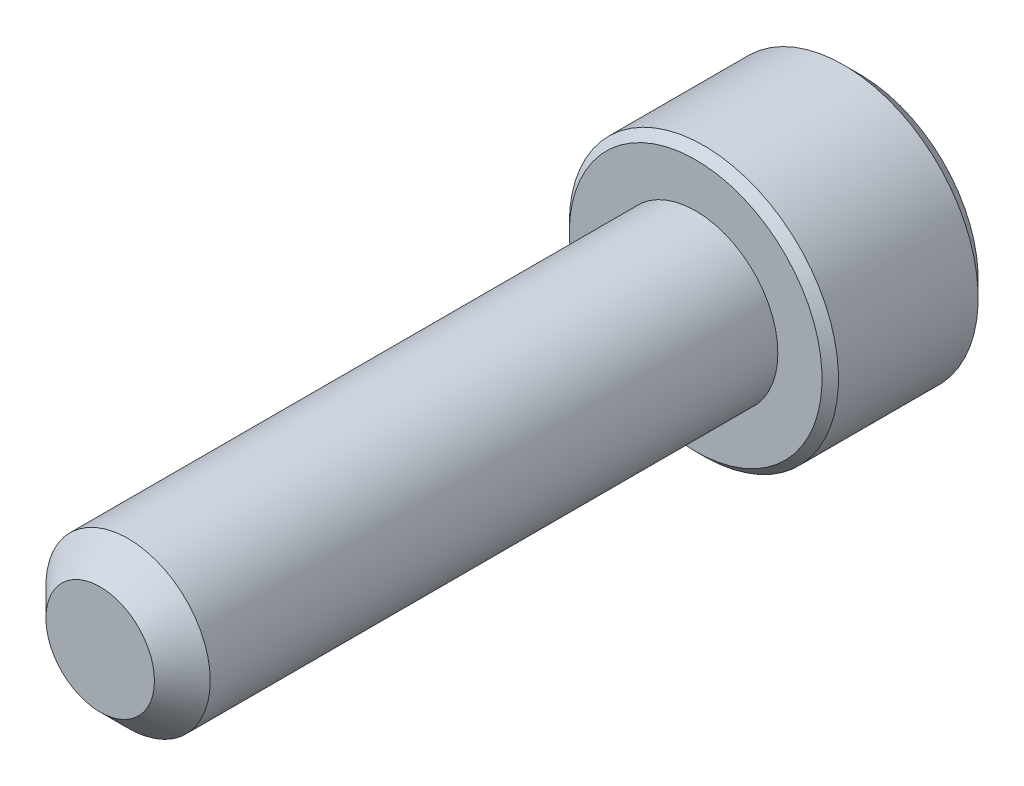
ISO-10303-21;
HEADER;
FILE_DESCRIPTION(('STEP AP214'),'2;1');
FILE_NAME('part.step','',(''),(''),'','','');
FILE_SCHEMA(('AUTOMOTIVE_DESIGN { 1 0 10303 214 1 1 1 1 }'));
ENDSEC;
DATA;
#1=APPLICATION_CONTEXT('core data for automotive mechanical design processes');
#2=APPLICATION_PROTOCOL_DEFINITION('international standard','automotive_design',2000,#1);
#3=PRODUCT_CONTEXT('',#1,'mechanical');
#4=PRODUCT('Part','Part','',(#3));
#5=PRODUCT_RELATED_PRODUCT_CATEGORY('part','',(#4));
#6=PRODUCT_DEFINITION_FORMATION('','',#4);
#7=PRODUCT_DEFINITION_CONTEXT('part definition',#1,'design');
#8=PRODUCT_DEFINITION('design','',#6,#7);
#9=PRODUCT_DEFINITION_SHAPE('','',#8);
#10=(LENGTH_UNIT() NAMED_UNIT(*) SI_UNIT(.MILLI.,.METRE.));
#11=(NAMED_UNIT(*) PLANE_ANGLE_UNIT() SI_UNIT($,.RADIAN.));
#12=(NAMED_UNIT(*) SI_UNIT($,.STERADIAN.) SOLID_ANGLE_UNIT());
#13=UNCERTAINTY_MEASURE_WITH_UNIT(LENGTH_MEASURE(1.E-05),#10,'distance_accuracy_value','');
#14=(GEOMETRIC_REPRESENTATION_CONTEXT(3) GLOBAL_UNCERTAINTY_ASSIGNED_CONTEXT((#13)) GLOBAL_UNIT_ASSIGNED_CONTEXT((#10,
#11,#12)) REPRESENTATION_CONTEXT('',''));
#15=CARTESIAN_POINT('',(0.,0.,0.));
#16=DIRECTION('',(0.,0.,1.));
#17=DIRECTION('',(1.,0.,0.));
#18=AXIS2_PLACEMENT_3D('',#15,#16,#17);
#19=CARTESIAN_POINT('',(0.,0.,-12.7));
#20=DIRECTION('',(0.,0.,1.));
#21=DIRECTION('',(1.,0.,0.));
#22=AXIS2_PLACEMENT_3D('',#19,#20,#21);
#23=CYLINDRICAL_SURFACE('',#22,1.7526);
#24=CARTESIAN_POINT('',(0.,0.,-0.595312500000002));
#25=DIRECTION('',(0.,0.,1.));
#26=DIRECTION('',(1.,0.,0.));
#27=AXIS2_PLACEMENT_3D('',#24,#25,#26);
#28=CIRCLE('',#27,1.7526);
#29=CARTESIAN_POINT('',(1.7526,0.,-0.595312500000002));
#30=VERTEX_POINT('',#29);
#31=EDGE_CURVE('E111',#30,#30,#28,.F.);
#32=ORIENTED_EDGE('',*,*,#31,.T.);
#33=EDGE_LOOP('',(#32));
#34=FACE_BOUND('',#33,.T.);
#35=CARTESIAN_POINT('',(0.,0.,-12.7));
#36=DIRECTION('',(0.,0.,-1.));
#37=DIRECTION('',(-1.,0.,0.));
#38=AXIS2_PLACEMENT_3D('',#35,#36,#37);
#39=CIRCLE('',#38,1.7526);
#40=CARTESIAN_POINT('',(-1.7526,0.,-12.7));
#41=VERTEX_POINT('',#40);
#42=EDGE_CURVE('E211',#41,#41,#39,.F.);
#43=ORIENTED_EDGE('',*,*,#42,.T.);
#44=EDGE_LOOP('',(#43));
#45=FACE_BOUND('',#44,.T.);
#46=ADVANCED_FACE('F37',(#34,#45),#23,.T.);
#47=CARTESIAN_POINT('',(0.,0.,0.));
#48=DIRECTION('',(0.,0.,1.));
#49=DIRECTION('',(1.,0.,0.));
#50=AXIS2_PLACEMENT_3D('',#47,#48,#49);
#51=PLANE('',#50);
#52=CARTESIAN_POINT('',(0.,0.,0.));
#53=DIRECTION('',(0.,0.,1.));
#54=DIRECTION('',(1.,0.,0.));
#55=AXIS2_PLACEMENT_3D('',#52,#53,#54);
#56=CIRCLE('',#55,1.1572875);
#57=CARTESIAN_POINT('',(1.1572875,0.,0.));
#58=VERTEX_POINT('',#57);
#59=EDGE_CURVE('E210',#58,#58,#56,.T.);
#60=ORIENTED_EDGE('',*,*,#59,.T.);
#61=EDGE_LOOP('',(#60));
#62=FACE_BOUND('',#61,.T.);
#63=ADVANCED_FACE('F188',(#62),#51,.T.);
#64=CARTESIAN_POINT('',(0.,0.,0.));
#65=DIRECTION('',(0.,0.,-1.));
#66=DIRECTION('',(-1.,0.,0.));
#67=AXIS2_PLACEMENT_3D('',#64,#65,#66);
#68=CONICAL_SURFACE('',#67,1.1572875,0.785398163397447);
#69=ORIENTED_EDGE('',*,*,#31,.F.);
#70=EDGE_LOOP('',(#69));
#71=FACE_BOUND('',#70,.T.);
#72=ORIENTED_EDGE('',*,*,#59,.F.);
#73=EDGE_LOOP('',(#72));
#74=FACE_BOUND('',#73,.T.);
#75=ADVANCED_FACE('F194',(#71,#74),#68,.T.);
#76=CARTESIAN_POINT('',(0.,0.,-16.2052));
#77=DIRECTION('',(0.,0.,1.));
#78=DIRECTION('',(1.,0.,0.));
#79=AXIS2_PLACEMENT_3D('',#76,#77,#78);
#80=CYLINDRICAL_SURFACE('',#79,2.8702);
#81=CARTESIAN_POINT('',(0.,0.,-12.87526));
#82=DIRECTION('',(0.,0.,-1.));
#83=DIRECTION('',(-1.,0.,0.));
#84=AXIS2_PLACEMENT_3D('',#81,#82,#83);
#85=CIRCLE('',#84,2.8702);
#86=CARTESIAN_POINT('',(-2.8702,0.,-12.87526));
#87=VERTEX_POINT('',#86);
#88=EDGE_CURVE('E45',#87,#87,#85,.T.);
#89=ORIENTED_EDGE('',*,*,#88,.T.);
#90=EDGE_LOOP('',(#89));
#91=FACE_BOUND('',#90,.T.);
#92=CARTESIAN_POINT('',(0.,0.,-15.85468));
#93=DIRECTION('',(0.,0.,-1.));
#94=DIRECTION('',(-1.,0.,0.));
#95=AXIS2_PLACEMENT_3D('',#92,#93,#94);
#96=CIRCLE('',#95,2.8702);
#97=CARTESIAN_POINT('',(-2.8702,0.,-15.85468));
#98=VERTEX_POINT('',#97);
#99=EDGE_CURVE('E171',#98,#98,#96,.F.);
#100=ORIENTED_EDGE('',*,*,#99,.T.);
#101=EDGE_LOOP('',(#100));
#102=FACE_BOUND('',#101,.T.);
#103=ADVANCED_FACE('F176',(#91,#102),#80,.T.);
#104=CARTESIAN_POINT('',(0.,0.,-16.2052));
#105=DIRECTION('',(0.,0.,-1.));
#106=DIRECTION('',(-1.,0.,0.));
#107=AXIS2_PLACEMENT_3D('',#104,#105,#106);
#108=PLANE('',#107);
#109=CARTESIAN_POINT('',(0.,0.,-16.2052));
#110=DIRECTION('',(0.,0.,-1.));
#111=DIRECTION('',(-1.,0.,0.));
#112=AXIS2_PLACEMENT_3D('',#109,#110,#111);
#113=CIRCLE('',#112,2.51968);
#114=CARTESIAN_POINT('',(-2.51968,0.,-16.2052));
#115=VERTEX_POINT('',#114);
#116=EDGE_CURVE('E110',#115,#115,#113,.T.);
#117=ORIENTED_EDGE('',*,*,#116,.T.);
#118=EDGE_LOOP('',(#117));
#119=FACE_BOUND('',#118,.T.);
#120=CARTESIAN_POINT('',(0.,0.,-16.2052));
#121=DIRECTION('',(0.,0.,-1.));
#122=DIRECTION('',(-1.,0.,0.));
#123=AXIS2_PLACEMENT_3D('',#120,#121,#122);
#124=CIRCLE('',#123,1.60395121659243);
#125=CARTESIAN_POINT('',(-1.3890625,0.801975608296217,-16.2052));
#126=VERTEX_POINT('',#125);
#127=CARTESIAN_POINT('',(0.,1.60395121659243,-16.2052));
#128=VERTEX_POINT('',#127);
#129=EDGE_CURVE('E91',#126,#128,#124,.T.);
#130=ORIENTED_EDGE('',*,*,#129,.F.);
#131=CARTESIAN_POINT('',(-1.3890625,-0.801975608296215,-16.2052));
#132=VERTEX_POINT('',#131);
#133=EDGE_CURVE('E51',#132,#126,#124,.T.);
#134=ORIENTED_EDGE('',*,*,#133,.F.);
#135=CARTESIAN_POINT('',(0.,-1.60395121659243,-16.2052));
#136=VERTEX_POINT('',#135);
#137=EDGE_CURVE('E267',#136,#132,#124,.T.);
#138=ORIENTED_EDGE('',*,*,#137,.F.);
#139=CARTESIAN_POINT('',(1.3890625,-0.801975608296215,-16.2052));
#140=VERTEX_POINT('',#139);
#141=EDGE_CURVE('E58',#140,#136,#124,.T.);
#142=ORIENTED_EDGE('',*,*,#141,.F.);
#143=CARTESIAN_POINT('',(1.3890625,0.801975608296215,-16.2052));
#144=VERTEX_POINT('',#143);
#145=EDGE_CURVE('E132',#144,#140,#124,.T.);
#146=ORIENTED_EDGE('',*,*,#145,.F.);
#147=EDGE_CURVE('E100',#128,#144,#124,.T.);
#148=ORIENTED_EDGE('',*,*,#147,.F.);
#149=EDGE_LOOP('',(#130,#134,#138,#142,#146,#148));
#150=FACE_BOUND('',#149,.T.);
#151=ADVANCED_FACE('F131',(#119,#150),#108,.T.);
#152=CARTESIAN_POINT('',(0.,0.,-12.7));
#153=DIRECTION('',(0.,0.,-1.));
#154=DIRECTION('',(-1.,0.,0.));
#155=AXIS2_PLACEMENT_3D('',#152,#153,#154);
#156=PLANE('',#155);
#157=CARTESIAN_POINT('',(0.,0.,-12.7));
#158=DIRECTION('',(0.,0.,-1.));
#159=DIRECTION('',(-1.,0.,0.));
#160=AXIS2_PLACEMENT_3D('',#157,#158,#159);
#161=CIRCLE('',#160,2.69494);
#162=CARTESIAN_POINT('',(-2.69494,0.,-12.7));
#163=VERTEX_POINT('',#162);
#164=EDGE_CURVE('E12',#163,#163,#161,.F.);
#165=ORIENTED_EDGE('',*,*,#164,.T.);
#166=EDGE_LOOP('',(#165));
#167=FACE_BOUND('',#166,.T.);
#168=ORIENTED_EDGE('',*,*,#42,.F.);
#169=EDGE_LOOP('',(#168));
#170=FACE_BOUND('',#169,.T.);
#171=ADVANCED_FACE('F279',(#167,#170),#156,.F.);
#172=CARTESIAN_POINT('',(0.,0.,-16.2052));
#173=DIRECTION('',(0.,0.,-1.));
#174=DIRECTION('',(-1.,0.,0.));
#175=AXIS2_PLACEMENT_3D('',#172,#173,#174);
#176=CONICAL_SURFACE('',#175,1.60395121659243,0.78539816339745);
#177=ORIENTED_EDGE('',*,*,#147,.T.);
#178=CARTESIAN_POINT('',(-0.000200000000000534,1.60406668664627,-16.2053154825221));
#179=CARTESIAN_POINT('',(0.047554814899585,1.57649543140889,-16.177764786881));
#180=CARTESIAN_POINT('',(0.0961082129767667,1.54846311395896,-16.1518319141145));
#181=CARTESIAN_POINT('',(0.195114281423183,1.49130193369001,-16.1043489608708));
#182=CARTESIAN_POINT('',(0.245576372730139,1.46216763169007,-16.0828253080794));
#183=CARTESIAN_POINT('',(0.347330835284908,1.40341966534283,-16.0459546019866));
#184=CARTESIAN_POINT('',(0.398597278416374,1.37382097060048,-16.0305148513149));
#185=CARTESIAN_POINT('',(0.502259069123937,1.31397180783079,-16.0067264581829));
#186=CARTESIAN_POINT('',(0.554651247789431,1.28372316937484,-15.9983600517165));
#187=CARTESIAN_POINT('',(0.644944084544834,1.23159257576821,-15.9908113663708));
#188=CARTESIAN_POINT('',(0.6827280342556,1.20977800223165,-15.9896936971037));
#189=CARTESIAN_POINT('',(0.758229287800437,1.16618733317339,-15.9915750513552));
#190=CARTESIAN_POINT('',(0.795946575086517,1.14441124720567,-15.9945749834252));
#191=CARTESIAN_POINT('',(0.871018018906519,1.10106872890774,-16.0045189567457));
#192=CARTESIAN_POINT('',(0.908371804329552,1.0795025108385,-16.0114666704902));
#193=CARTESIAN_POINT('',(0.982452435596039,1.03673203843505,-16.0289288810594));
#194=CARTESIAN_POINT('',(1.01917900521513,1.01552794357906,-16.0394449088769));
#195=CARTESIAN_POINT('',(1.11325413716703,0.961213640822578,-16.0706664203823));
#196=CARTESIAN_POINT('',(1.17001916310317,0.928440337817795,-16.0937263608604));
#197=CARTESIAN_POINT('',(1.25348479270274,0.880251434100403,-16.1326547118294));
#198=CARTESIAN_POINT('',(1.28098915116073,0.864371785340791,-16.1463318145832));
#199=CARTESIAN_POINT('',(1.33549195495674,0.832904576897577,-16.1749348081189));
#200=CARTESIAN_POINT('',(1.36249063449213,0.817316882000056,-16.1898601023926));
#201=CARTESIAN_POINT('',(1.3892625,0.801860138242377,-16.2053154825221));
#202=B_SPLINE_CURVE_WITH_KNOTS('',3,(#178,#179,#180,#181,#182,#183,#184,#185,#186,#187,#188,
#189,#190,#191,#192,#193,#194,#195,#196,#197,#198,#199,#200,#201),.UNSPECIFIED.,.F.,.F.,(4,2,2,
2,2,2,2,2,2,2,2,4),(0.,0.185054161583333,0.371186974731966,0.554362620151553,0.737076859824673,
0.867821902366107,0.998595798526818,1.12949154907136,1.26044353188444,1.46846066168042,
1.57218026599103,1.67585058309997),.UNSPECIFIED.);
#203=EDGE_CURVE('E105',#128,#144,#202,.T.);
#204=ORIENTED_EDGE('',*,*,#203,.F.);
#205=EDGE_LOOP('',(#177,#204));
#206=FACE_BOUND('',#205,.T.);
#207=ADVANCED_FACE('F106',(#206),#176,.F.);
#208=ORIENTED_EDGE('',*,*,#145,.T.);
#209=CARTESIAN_POINT('',(1.3890625,-1.61940394480745,-16.7347819482223));
#210=CARTESIAN_POINT('',(1.3890625,-1.58006115349146,-16.7049243271923));
#211=CARTESIAN_POINT('',(1.3890625,-1.54050132955006,-16.6753535181349));
#212=CARTESIAN_POINT('',(1.3890625,-1.46085876241779,-16.6169045446385));
#213=CARTESIAN_POINT('',(1.3890625,-1.42077589246553,-16.5880265531062));
#214=CARTESIAN_POINT('',(1.3890625,-1.29902274997118,-16.5021982113368));
#215=CARTESIAN_POINT('',(1.3890625,-1.21644571524143,-16.4465129842253));
#216=CARTESIAN_POINT('',(1.3890625,-1.04315507977619,-16.3370119606919));
#217=CARTESIAN_POINT('',(1.3890625,-0.952248476193911,-16.283498197639));
#218=CARTESIAN_POINT('',(1.3890625,-0.765869525131635,-16.1854818620338));
#219=CARTESIAN_POINT('',(1.3890625,-0.670413981853178,-16.1409488871386));
#220=CARTESIAN_POINT('',(1.3890625,-0.527324185824119,-16.0864610332753));
#221=CARTESIAN_POINT('',(1.3890625,-0.481850777039666,-16.0708565157759));
#222=CARTESIAN_POINT('',(1.3890625,-0.389788715477723,-16.0432958930187));
#223=CARTESIAN_POINT('',(1.3890625,-0.343199987774419,-16.0313400336195));
#224=CARTESIAN_POINT('',(1.3890625,-0.249973786412084,-16.0119026508989));
#225=CARTESIAN_POINT('',(1.3890625,-0.20335281289058,-16.0043432373454));
#226=CARTESIAN_POINT('',(1.3890625,-0.109590268814354,-15.9938495716361));
#227=CARTESIAN_POINT('',(1.3890625,-0.0624487940539218,-15.9909144822393));
#228=CARTESIAN_POINT('',(1.3890625,0.0300876528594538,-15.9898959870312));
#229=CARTESIAN_POINT('',(1.3890625,0.0754806899085092,-15.9916318778689));
#230=CARTESIAN_POINT('',(1.3890625,0.165887420036847,-15.9994562074487));
#231=CARTESIAN_POINT('',(1.3890625,0.210901076451833,-16.0055450621007));
#232=CARTESIAN_POINT('',(1.3890625,0.300985584808155,-16.0218429071109));
#233=CARTESIAN_POINT('',(1.3890625,0.346043426477339,-16.0321227134166));
#234=CARTESIAN_POINT('',(1.3890625,0.435171985795335,-16.0562501165965));
#235=CARTESIAN_POINT('',(1.3890625,0.479242778772565,-16.0700974401937));
#236=CARTESIAN_POINT('',(1.3890625,0.61709785513739,-16.1186456952925));
#237=CARTESIAN_POINT('',(1.3890625,0.708943143387238,-16.1588382623019));
#238=CARTESIAN_POINT('',(1.3890625,0.888326863327376,-16.2482263268257));
#239=CARTESIAN_POINT('',(1.3890625,0.97584844310253,-16.2974539890072));
#240=CARTESIAN_POINT('',(1.3890625,1.14312734298093,-16.399041791674));
#241=CARTESIAN_POINT('',(1.3890625,1.22305448923177,-16.4511257684336));
#242=CARTESIAN_POINT('',(1.3890625,1.3408107215704,-16.5316537579098));
#243=CARTESIAN_POINT('',(1.3890625,1.37955507371222,-16.5587826125004));
#244=CARTESIAN_POINT('',(1.3890625,1.4565136416918,-16.61376083201));
#245=CARTESIAN_POINT('',(1.3890625,1.49472800051003,-16.6416099965591));
#246=CARTESIAN_POINT('',(1.3890625,1.53272159252287,-16.669757934727));
#247=B_SPLINE_CURVE_WITH_KNOTS('',3,(#209,#210,#211,#212,#213,#214,#215,#216,#217,#218,#219,
#220,#221,#222,#223,#224,#225,#226,#227,#228,#229,#230,#231,#232,#233,#234,#235,#236,#237,#238,
#239,#240,#241,#242,#243,#244,#245,#246),.UNSPECIFIED.,.F.,.F.,(4,2,2,2,2,2,2,2,2,2,2,2,2,2,2,2,
2,2,4),(0.,0.148165097735296,0.296366796320979,0.595030749860533,0.911241326915099,
1.22636278192646,1.37047020890679,1.51458734417271,1.65606664391464,1.79752032566969,
1.93358111293096,2.06965490204564,2.20813012759239,2.34659474888992,2.64647835597473,
2.94745101021194,3.23350725563862,3.37539574691568,3.51724518455275),.UNSPECIFIED.);
#248=EDGE_CURVE('E99',#144,#140,#247,.F.);
#249=ORIENTED_EDGE('',*,*,#248,.F.);
#250=EDGE_LOOP('',(#208,#249));
#251=FACE_BOUND('',#250,.T.);
#252=ADVANCED_FACE('F273',(#251),#176,.F.);
#253=ORIENTED_EDGE('',*,*,#141,.T.);
#254=CARTESIAN_POINT('',(1.3892625,-0.801860138242376,-16.2053154825221));
#255=CARTESIAN_POINT('',(1.34150768510041,-0.829431393479753,-16.177764786881));
#256=CARTESIAN_POINT('',(1.29295428702323,-0.857463710929685,-16.1518319141145));
#257=CARTESIAN_POINT('',(1.19394821857682,-0.91462489119863,-16.1043489608708));
#258=CARTESIAN_POINT('',(1.14348612726986,-0.943759193198573,-16.0828253080794));
#259=CARTESIAN_POINT('',(1.04173166471509,-1.00250715954581,-16.0459546019866));
#260=CARTESIAN_POINT('',(0.990465221583625,-1.03210585428816,-16.0305148513149));
#261=CARTESIAN_POINT('',(0.886803430876063,-1.09195501705785,-16.0067264581829));
#262=CARTESIAN_POINT('',(0.834411252210569,-1.1222036555138,-15.9983600517165));
#263=CARTESIAN_POINT('',(0.744118415455167,-1.17433424912043,-15.9908113663708));
#264=CARTESIAN_POINT('',(0.706334465744401,-1.19614882265699,-15.9896936971037));
#265=CARTESIAN_POINT('',(0.630833212199565,-1.23973949171525,-15.9915750513552));
#266=CARTESIAN_POINT('',(0.593115924913484,-1.26151557768297,-15.9945749834252));
#267=CARTESIAN_POINT('',(0.518044481093482,-1.30485809598091,-16.0045189567457));
#268=CARTESIAN_POINT('',(0.480690695670449,-1.32642431405015,-16.0114666704902));
#269=CARTESIAN_POINT('',(0.406610064403962,-1.36919478645359,-16.0289288810594));
#270=CARTESIAN_POINT('',(0.369883494784874,-1.39039888130958,-16.0394449088769));
#271=CARTESIAN_POINT('',(0.275808362832968,-1.44471318406606,-16.0706664203823));
#272=CARTESIAN_POINT('',(0.219043336896833,-1.47748648707085,-16.0937263608604));
#273=CARTESIAN_POINT('',(0.135577707297264,-1.52567539078824,-16.1326547118294));
#274=CARTESIAN_POINT('',(0.108073348839269,-1.54155503954785,-16.1463318145832));
#275=CARTESIAN_POINT('',(0.0535705450432624,-1.57302224799107,-16.1749348081189));
#276=CARTESIAN_POINT('',(0.0265718655078741,-1.58860994288859,-16.1898601023926));
#277=CARTESIAN_POINT('',(-0.000199999999998959,-1.60406668664627,-16.2053154825221));
#278=B_SPLINE_CURVE_WITH_KNOTS('',3,(#254,#255,#256,#257,#258,#259,#260,#261,#262,#263,#264,
#265,#266,#267,#268,#269,#270,#271,#272,#273,#274,#275,#276,#277),.UNSPECIFIED.,.F.,.F.,(4,2,2,
2,2,2,2,2,2,2,2,4),(0.,0.185054161583331,0.371186974731966,0.554362620151551,0.737076859824669,
0.867821902366103,0.998595798526814,1.12949154907136,1.26044353188443,1.46846066168042,
1.57218026599103,1.67585058309997),.UNSPECIFIED.);
#279=EDGE_CURVE('E141',#140,#136,#278,.T.);
#280=ORIENTED_EDGE('',*,*,#279,.F.);
#281=EDGE_LOOP('',(#253,#280));
#282=FACE_BOUND('',#281,.T.);
#283=ADVANCED_FACE('F270',(#282),#176,.F.);
#284=ORIENTED_EDGE('',*,*,#137,.T.);
#285=CARTESIAN_POINT('',(0.000199999999999772,-1.60406668664627,-16.2053154825221));
#286=CARTESIAN_POINT('',(-0.047554814899586,-1.57649543140889,-16.177764786881));
#287=CARTESIAN_POINT('',(-0.0961082129767678,-1.54846311395896,-16.1518319141145));
#288=CARTESIAN_POINT('',(-0.195114281423185,-1.49130193369001,-16.1043489608708));
#289=CARTESIAN_POINT('',(-0.245576372730141,-1.46216763169007,-16.0828253080794));
#290=CARTESIAN_POINT('',(-0.34733083528491,-1.40341966534283,-16.0459546019866));
#291=CARTESIAN_POINT('',(-0.398597278416375,-1.37382097060048,-16.0305148513149));
#292=CARTESIAN_POINT('',(-0.502259069123937,-1.31397180783079,-16.0067264581829));
#293=CARTESIAN_POINT('',(-0.55465124778943,-1.28372316937484,-15.9983600517165));
#294=CARTESIAN_POINT('',(-0.644944084544832,-1.23159257576821,-15.9908113663708));
#295=CARTESIAN_POINT('',(-0.682728034255598,-1.20977800223165,-15.9896936971037));
#296=CARTESIAN_POINT('',(-0.758229287800435,-1.16618733317339,-15.9915750513552));
#297=CARTESIAN_POINT('',(-0.795946575086516,-1.14441124720567,-15.9945749834252));
#298=CARTESIAN_POINT('',(-0.871018018906518,-1.10106872890774,-16.0045189567457));
#299=CARTESIAN_POINT('',(-0.908371804329551,-1.0795025108385,-16.0114666704902));
#300=CARTESIAN_POINT('',(-0.982452435596038,-1.03673203843505,-16.0289288810594));
#301=CARTESIAN_POINT('',(-1.01917900521513,-1.01552794357906,-16.0394449088769));
#302=CARTESIAN_POINT('',(-1.11325413716703,-0.961213640822578,-16.0706664203823));
#303=CARTESIAN_POINT('',(-1.17001916310317,-0.928440337817794,-16.0937263608604));
#304=CARTESIAN_POINT('',(-1.25348479270274,-0.880251434100402,-16.1326547118294));
#305=CARTESIAN_POINT('',(-1.28098915116073,-0.86437178534079,-16.1463318145832));
#306=CARTESIAN_POINT('',(-1.33549195495674,-0.832904576897577,-16.1749348081189));
#307=CARTESIAN_POINT('',(-1.36249063449213,-0.817316882000056,-16.1898601023926));
#308=CARTESIAN_POINT('',(-1.3892625,-0.801860138242377,-16.2053154825221));
#309=B_SPLINE_CURVE_WITH_KNOTS('',3,(#285,#286,#287,#288,#289,#290,#291,#292,#293,#294,#295,
#296,#297,#298,#299,#300,#301,#302,#303,#304,#305,#306,#307,#308),.UNSPECIFIED.,.F.,.F.,(4,2,2,
2,2,2,2,2,2,2,2,4),(0.,0.185054161583332,0.371186974731966,0.554362620151552,0.737076859824669,
0.867821902366103,0.998595798526814,1.12949154907136,1.26044353188443,1.46846066168042,
1.57218026599103,1.67585058309997),.UNSPECIFIED.);
#310=EDGE_CURVE('E245',#136,#132,#309,.T.);
#311=ORIENTED_EDGE('',*,*,#310,.F.);
#312=EDGE_LOOP('',(#284,#311));
#313=FACE_BOUND('',#312,.T.);
#314=ADVANCED_FACE('F269',(#313),#176,.F.);
#315=ORIENTED_EDGE('',*,*,#133,.T.);
#316=CARTESIAN_POINT('',(-1.3890625,-1.61940394489368,-16.7347819482877));
#317=CARTESIAN_POINT('',(-1.3890625,-1.58006115357525,-16.7049243272552));
#318=CARTESIAN_POINT('',(-1.3890625,-1.54050132963141,-16.6753535181953));
#319=CARTESIAN_POINT('',(-1.3890625,-1.46085876249422,-16.6169045446939));
#320=CARTESIAN_POINT('',(-1.3890625,-1.42077589253949,-16.5880265531591));
#321=CARTESIAN_POINT('',(-1.3890625,-1.29902275003757,-16.5021982113821));
#322=CARTESIAN_POINT('',(-1.3890625,-1.21644571530268,-16.4465129842656));
#323=CARTESIAN_POINT('',(-1.3890625,-1.04315507982623,-16.3370119607219));
#324=CARTESIAN_POINT('',(-1.3890625,-0.952248476237844,-16.2834981976636));
#325=CARTESIAN_POINT('',(-1.3890625,-0.765869525162843,-16.1854818620486));
#326=CARTESIAN_POINT('',(-1.3890625,-0.670413981877767,-16.140948887149));
#327=CARTESIAN_POINT('',(-1.3890625,-0.527324185843738,-16.0864610332824));
#328=CARTESIAN_POINT('',(-1.3890625,-0.481850777061386,-16.0708565157831));
#329=CARTESIAN_POINT('',(-1.3890625,-0.389788715503717,-16.0432958930258));
#330=CARTESIAN_POINT('',(-1.3890625,-0.343199987802587,-16.0313400336264));
#331=CARTESIAN_POINT('',(-1.3890625,-0.249973786444528,-16.0119026509047));
#332=CARTESIAN_POINT('',(-1.3890625,-0.203352812925126,-16.0043432373505));
#333=CARTESIAN_POINT('',(-1.3890625,-0.109590268853037,-15.9938495716392));
#334=CARTESIAN_POINT('',(-1.3890625,-0.0624487940946411,-15.9909144822412));
#335=CARTESIAN_POINT('',(-1.3890625,0.0300876528150609,-15.9898959870303));
#336=CARTESIAN_POINT('',(-1.3890625,0.0754806898624732,-15.9916318778665));
#337=CARTESIAN_POINT('',(-1.3890625,0.165887419987694,-15.9994562074429));
#338=CARTESIAN_POINT('',(-1.3890625,0.210901076401206,-16.0055450620931));
#339=CARTESIAN_POINT('',(-1.3890625,0.300985584754619,-16.0218429070996));
#340=CARTESIAN_POINT('',(-1.3890625,0.346043426422372,-16.0321227134034));
#341=CARTESIAN_POINT('',(-1.3890625,0.435171985737648,-16.0562501165793));
#342=CARTESIAN_POINT('',(-1.3890625,0.479242778713588,-16.0700974401744));
#343=CARTESIAN_POINT('',(-1.3890625,0.61709785506566,-16.1186456952639));
#344=CARTESIAN_POINT('',(-1.3890625,0.708943143304683,-16.1588382622647));
#345=CARTESIAN_POINT('',(-1.3890625,0.888326863224002,-16.2482263267703));
#346=CARTESIAN_POINT('',(-1.3890625,0.975848442989167,-16.2974539889421));
#347=CARTESIAN_POINT('',(-1.3890625,1.14312734284962,-16.3990417915907));
#348=CARTESIAN_POINT('',(-1.3890625,1.22305448909243,-16.4511257683416));
#349=CARTESIAN_POINT('',(-1.3890625,1.34081072141919,-16.5316537578048));
#350=CARTESIAN_POINT('',(-1.3890625,1.37955507355711,-16.5587826123911));
#351=CARTESIAN_POINT('',(-1.3890625,1.45651364152892,-16.6137608318921));
#352=CARTESIAN_POINT('',(-1.3890625,1.49472800034327,-16.6416099964369));
#353=CARTESIAN_POINT('',(-1.3890625,1.53272159235225,-16.6697579346005));
#354=B_SPLINE_CURVE_WITH_KNOTS('',3,(#316,#317,#318,#319,#320,#321,#322,#323,#324,#325,#326,
#327,#328,#329,#330,#331,#332,#333,#334,#335,#336,#337,#338,#339,#340,#341,#342,#343,#344,#345,
#346,#347,#348,#349,#350,#351,#352,#353),.UNSPECIFIED.,.F.,.F.,(4,2,2,2,2,2,2,2,2,2,2,2,2,2,2,2,
2,2,4),(0.,0.148165097745704,0.296366796341797,0.595030749902561,0.911241326980938,
1.22636278201588,1.37047020899011,1.51458734424994,1.65606664398604,1.79752032573526,
1.93358111299144,2.06965490210104,2.20813012764229,2.34659474893434,2.6464783559792,
2.94745101017619,3.23350725556849,3.37539574682858,3.5172451844487),.UNSPECIFIED.);
#355=EDGE_CURVE('E121',#132,#126,#354,.T.);
#356=ORIENTED_EDGE('',*,*,#355,.F.);
#357=EDGE_LOOP('',(#315,#356));
#358=FACE_BOUND('',#357,.T.);
#359=ADVANCED_FACE('F286',(#358),#176,.F.);
#360=ORIENTED_EDGE('',*,*,#129,.T.);
#361=CARTESIAN_POINT('',(-1.3892625,0.801860138242378,-16.2053154825221));
#362=CARTESIAN_POINT('',(-1.34150768510041,0.829431393479755,-16.177764786881));
#363=CARTESIAN_POINT('',(-1.29295428702323,0.857463710929687,-16.1518319141145));
#364=CARTESIAN_POINT('',(-1.19394821857681,0.914624891198632,-16.1043489608708));
#365=CARTESIAN_POINT('',(-1.14348612726986,0.943759193198575,-16.0828253080794));
#366=CARTESIAN_POINT('',(-1.04173166471509,1.00250715954582,-16.0459546019866));
#367=CARTESIAN_POINT('',(-0.990465221583623,1.03210585428816,-16.0305148513149));
#368=CARTESIAN_POINT('',(-0.886803430876061,1.09195501705785,-16.0067264581829));
#369=CARTESIAN_POINT('',(-0.834411252210566,1.12220365551381,-15.9983600517165));
#370=CARTESIAN_POINT('',(-0.744118415455163,1.17433424912043,-15.9908113663708));
#371=CARTESIAN_POINT('',(-0.706334465744397,1.19614882265699,-15.9896936971037));
#372=CARTESIAN_POINT('',(-0.630833212199561,1.23973949171526,-15.9915750513552));
#373=CARTESIAN_POINT('',(-0.59311592491348,1.26151557768298,-15.9945749834252));
#374=CARTESIAN_POINT('',(-0.518044481093478,1.30485809598091,-16.0045189567457));
#375=CARTESIAN_POINT('',(-0.480690695670445,1.32642431405015,-16.0114666704902));
#376=CARTESIAN_POINT('',(-0.406610064403958,1.36919478645359,-16.0289288810594));
#377=CARTESIAN_POINT('',(-0.36988349478487,1.39039888130958,-16.0394449088769));
#378=CARTESIAN_POINT('',(-0.275808362832965,1.44471318406607,-16.0706664203823));
#379=CARTESIAN_POINT('',(-0.219043336896832,1.47748648707085,-16.0937263608604));
#380=CARTESIAN_POINT('',(-0.135577707297265,1.52567539078824,-16.1326547118294));
#381=CARTESIAN_POINT('',(-0.108073348839269,1.54155503954785,-16.1463318145832));
#382=CARTESIAN_POINT('',(-0.0535705450432624,1.57302224799107,-16.1749348081189));
#383=CARTESIAN_POINT('',(-0.0265718655078738,1.58860994288859,-16.1898601023926));
#384=CARTESIAN_POINT('',(0.000199999999999513,1.60406668664627,-16.2053154825221));
#385=B_SPLINE_CURVE_WITH_KNOTS('',3,(#361,#362,#363,#364,#365,#366,#367,#368,#369,#370,#371,
#372,#373,#374,#375,#376,#377,#378,#379,#380,#381,#382,#383,#384),.UNSPECIFIED.,.F.,.F.,(4,2,2,
2,2,2,2,2,2,2,2,4),(0.,0.185054161583333,0.371186974731965,0.554362620151551,0.737076859824671,
0.867821902366105,0.998595798526816,1.12949154907136,1.26044353188444,1.46846066168041,
1.57218026599103,1.67585058309996),.UNSPECIFIED.);
#386=EDGE_CURVE('E95',#126,#128,#385,.T.);
#387=ORIENTED_EDGE('',*,*,#386,.F.);
#388=EDGE_LOOP('',(#360,#387));
#389=FACE_BOUND('',#388,.T.);
#390=ADVANCED_FACE('F93',(#389),#176,.F.);
#391=CARTESIAN_POINT('',(1.3890625,2.40592682488864,-14.12160625));
#392=DIRECTION('',(0.,0.,-1.));
#393=DIRECTION('',(-1.,0.,0.));
#394=AXIS2_PLACEMENT_3D('',#391,#392,#393);
#395=PLANE('',#394);
#396=DIRECTION('',(0.866025403784439,0.5,0.));
#397=VECTOR('',#396,1.);
#398=CARTESIAN_POINT('',(-1.3890625,0.801975608296216,-14.12160625));
#399=LINE('',#398,#397);
#400=CARTESIAN_POINT('',(-1.3890625,0.801975608296216,-14.12160625));
#401=VERTEX_POINT('',#400);
#402=CARTESIAN_POINT('',(0.,1.60395121659243,-14.12160625));
#403=VERTEX_POINT('',#402);
#404=EDGE_CURVE('E120',#401,#403,#399,.T.);
#405=ORIENTED_EDGE('',*,*,#404,.T.);
#406=DIRECTION('',(0.866025403784439,-0.5,0.));
#407=VECTOR('',#406,1.);
#408=CARTESIAN_POINT('',(0.,1.60395121659243,-14.12160625));
#409=LINE('',#408,#407);
#410=CARTESIAN_POINT('',(1.3890625,0.801975608296215,-14.12160625));
#411=VERTEX_POINT('',#410);
#412=EDGE_CURVE('E125',#403,#411,#409,.T.);
#413=ORIENTED_EDGE('',*,*,#412,.T.);
#414=DIRECTION('',(0.,-1.,0.));
#415=VECTOR('',#414,1.);
#416=CARTESIAN_POINT('',(1.3890625,0.801975608296215,-14.12160625));
#417=LINE('',#416,#415);
#418=CARTESIAN_POINT('',(1.3890625,-0.801975608296214,-14.12160625));
#419=VERTEX_POINT('',#418);
#420=EDGE_CURVE('E233',#411,#419,#417,.T.);
#421=ORIENTED_EDGE('',*,*,#420,.T.);
#422=DIRECTION('',(-0.866025403784439,-0.5,0.));
#423=VECTOR('',#422,1.);
#424=CARTESIAN_POINT('',(1.3890625,-0.801975608296214,-14.12160625));
#425=LINE('',#424,#423);
#426=CARTESIAN_POINT('',(0.,-1.60395121659243,-14.12160625));
#427=VERTEX_POINT('',#426);
#428=EDGE_CURVE('E230',#419,#427,#425,.T.);
#429=ORIENTED_EDGE('',*,*,#428,.T.);
#430=DIRECTION('',(-0.866025403784439,0.5,0.));
#431=VECTOR('',#430,1.);
#432=CARTESIAN_POINT('',(0.,-1.60395121659243,-14.12160625));
#433=LINE('',#432,#431);
#434=CARTESIAN_POINT('',(-1.3890625,-0.801975608296215,-14.12160625));
#435=VERTEX_POINT('',#434);
#436=EDGE_CURVE('E227',#427,#435,#433,.T.);
#437=ORIENTED_EDGE('',*,*,#436,.T.);
#438=DIRECTION('',(0.,1.,0.));
#439=VECTOR('',#438,1.);
#440=CARTESIAN_POINT('',(-1.3890625,-0.801975608296215,-14.12160625));
#441=LINE('',#440,#439);
#442=EDGE_CURVE('E128',#435,#401,#441,.T.);
#443=ORIENTED_EDGE('',*,*,#442,.T.);
#444=EDGE_LOOP('',(#405,#413,#421,#429,#437,#443));
#445=FACE_BOUND('',#444,.T.);
#446=ADVANCED_FACE('F160',(#445),#395,.T.);
#447=CARTESIAN_POINT('',(0.,1.60395121659243,-14.12160625));
#448=DIRECTION('',(0.5,0.866025403784439,0.));
#449=DIRECTION('',(-0.866025403784439,0.5,0.));
#450=AXIS2_PLACEMENT_3D('',#447,#448,#449);
#451=PLANE('',#450);
#452=DIRECTION('',(0.,0.,-1.));
#453=VECTOR('',#452,1.);
#454=CARTESIAN_POINT('',(0.,1.60395121659243,-14.12160625));
#455=LINE('',#454,#453);
#456=EDGE_CURVE('E117',#403,#128,#455,.T.);
#457=ORIENTED_EDGE('',*,*,#456,.T.);
#458=ORIENTED_EDGE('',*,*,#203,.T.);
#459=DIRECTION('',(0.,0.,-1.));
#460=VECTOR('',#459,1.);
#461=CARTESIAN_POINT('',(1.3890625,0.801975608296215,-14.12160625));
#462=LINE('',#461,#460);
#463=EDGE_CURVE('E127',#411,#144,#462,.T.);
#464=ORIENTED_EDGE('',*,*,#463,.F.);
#465=ORIENTED_EDGE('',*,*,#412,.F.);
#466=EDGE_LOOP('',(#457,#458,#464,#465));
#467=FACE_BOUND('',#466,.T.);
#468=ADVANCED_FACE('F123',(#467),#451,.F.);
#469=CARTESIAN_POINT('',(1.3890625,0.801975608296215,-14.12160625));
#470=DIRECTION('',(1.,0.,0.));
#471=DIRECTION('',(0.,1.,0.));
#472=AXIS2_PLACEMENT_3D('',#469,#470,#471);
#473=PLANE('',#472);
#474=ORIENTED_EDGE('',*,*,#463,.T.);
#475=ORIENTED_EDGE('',*,*,#248,.T.);
#476=DIRECTION('',(0.,0.,-1.));
#477=VECTOR('',#476,1.);
#478=CARTESIAN_POINT('',(1.3890625,-0.801975608296214,-14.12160625));
#479=LINE('',#478,#477);
#480=EDGE_CURVE('E216',#419,#140,#479,.T.);
#481=ORIENTED_EDGE('',*,*,#480,.F.);
#482=ORIENTED_EDGE('',*,*,#420,.F.);
#483=EDGE_LOOP('',(#474,#475,#481,#482));
#484=FACE_BOUND('',#483,.T.);
#485=ADVANCED_FACE('F149',(#484),#473,.F.);
#486=CARTESIAN_POINT('',(1.3890625,-0.801975608296214,-14.12160625));
#487=DIRECTION('',(0.5,-0.866025403784439,0.));
#488=DIRECTION('',(0.866025403784439,0.5,0.));
#489=AXIS2_PLACEMENT_3D('',#486,#487,#488);
#490=PLANE('',#489);
#491=ORIENTED_EDGE('',*,*,#480,.T.);
#492=ORIENTED_EDGE('',*,*,#279,.T.);
#493=DIRECTION('',(0.,0.,-1.));
#494=VECTOR('',#493,1.);
#495=CARTESIAN_POINT('',(0.,-1.60395121659243,-14.12160625));
#496=LINE('',#495,#494);
#497=EDGE_CURVE('E219',#427,#136,#496,.T.);
#498=ORIENTED_EDGE('',*,*,#497,.F.);
#499=ORIENTED_EDGE('',*,*,#428,.F.);
#500=EDGE_LOOP('',(#491,#492,#498,#499));
#501=FACE_BOUND('',#500,.T.);
#502=ADVANCED_FACE('F153',(#501),#490,.F.);
#503=CARTESIAN_POINT('',(0.,-1.60395121659243,-14.12160625));
#504=DIRECTION('',(-0.5,-0.866025403784439,0.));
#505=DIRECTION('',(0.866025403784439,-0.5,0.));
#506=AXIS2_PLACEMENT_3D('',#503,#504,#505);
#507=PLANE('',#506);
#508=ORIENTED_EDGE('',*,*,#497,.T.);
#509=ORIENTED_EDGE('',*,*,#310,.T.);
#510=DIRECTION('',(0.,0.,-1.));
#511=VECTOR('',#510,1.);
#512=CARTESIAN_POINT('',(-1.3890625,-0.801975608296215,-14.12160625));
#513=LINE('',#512,#511);
#514=EDGE_CURVE('E222',#435,#132,#513,.T.);
#515=ORIENTED_EDGE('',*,*,#514,.F.);
#516=ORIENTED_EDGE('',*,*,#436,.F.);
#517=EDGE_LOOP('',(#508,#509,#515,#516));
#518=FACE_BOUND('',#517,.T.);
#519=ADVANCED_FACE('F252',(#518),#507,.F.);
#520=CARTESIAN_POINT('',(-1.3890625,-0.801975608296215,-14.12160625));
#521=DIRECTION('',(-1.,0.,0.));
#522=DIRECTION('',(0.,-1.,0.));
#523=AXIS2_PLACEMENT_3D('',#520,#521,#522);
#524=PLANE('',#523);
#525=ORIENTED_EDGE('',*,*,#514,.T.);
#526=ORIENTED_EDGE('',*,*,#355,.T.);
#527=DIRECTION('',(0.,0.,-1.));
#528=VECTOR('',#527,1.);
#529=CARTESIAN_POINT('',(-1.3890625,0.801975608296216,-14.12160625));
#530=LINE('',#529,#528);
#531=EDGE_CURVE('E119',#401,#126,#530,.T.);
#532=ORIENTED_EDGE('',*,*,#531,.F.);
#533=ORIENTED_EDGE('',*,*,#442,.F.);
#534=EDGE_LOOP('',(#525,#526,#532,#533));
#535=FACE_BOUND('',#534,.T.);
#536=ADVANCED_FACE('F249',(#535),#524,.F.);
#537=CARTESIAN_POINT('',(-1.3890625,0.801975608296216,-14.12160625));
#538=DIRECTION('',(-0.5,0.866025403784439,0.));
#539=DIRECTION('',(-0.866025403784439,-0.5,0.));
#540=AXIS2_PLACEMENT_3D('',#537,#538,#539);
#541=PLANE('',#540);
#542=ORIENTED_EDGE('',*,*,#531,.T.);
#543=ORIENTED_EDGE('',*,*,#386,.T.);
#544=ORIENTED_EDGE('',*,*,#456,.F.);
#545=ORIENTED_EDGE('',*,*,#404,.F.);
#546=EDGE_LOOP('',(#542,#543,#544,#545));
#547=FACE_BOUND('',#546,.T.);
#548=ADVANCED_FACE('F115',(#547),#541,.F.);
#549=CARTESIAN_POINT('',(0.,0.,-16.2052));
#550=DIRECTION('',(0.,0.,1.));
#551=DIRECTION('',(1.,0.,0.));
#552=AXIS2_PLACEMENT_3D('',#549,#550,#551);
#553=CONICAL_SURFACE('',#552,2.51968,0.785398163397442);
#554=ORIENTED_EDGE('',*,*,#99,.F.);
#555=EDGE_LOOP('',(#554));
#556=FACE_BOUND('',#555,.T.);
#557=ORIENTED_EDGE('',*,*,#116,.F.);
#558=EDGE_LOOP('',(#557));
#559=FACE_BOUND('',#558,.T.);
#560=ADVANCED_FACE('F180',(#556,#559),#553,.T.);
#561=CARTESIAN_POINT('',(0.,0.,-12.87526));
#562=DIRECTION('',(0.,0.,-1.));
#563=DIRECTION('',(-1.,0.,0.));
#564=AXIS2_PLACEMENT_3D('',#561,#562,#563);
#565=CONICAL_SURFACE('',#564,2.8702,0.785398163397447);
#566=CARTESIAN_POINT('',(-2.69494,0.,-12.7));
#567=CARTESIAN_POINT('',(-2.696765625,0.,-12.701825625));
#568=CARTESIAN_POINT('',(-2.69859125,0.,-12.70365125));
#569=CARTESIAN_POINT('',(-2.7022425,0.,-12.7073025));
#570=CARTESIAN_POINT('',(-2.704068125,0.,-12.709128125));
#571=CARTESIAN_POINT('',(-2.707719375,0.,-12.712779375));
#572=CARTESIAN_POINT('',(-2.709545,0.,-12.714605));
#573=CARTESIAN_POINT('',(-2.71319625,0.,-12.71825625));
#574=CARTESIAN_POINT('',(-2.715021875,0.,-12.720081875));
#575=CARTESIAN_POINT('',(-2.718673125,0.,-12.723733125));
#576=CARTESIAN_POINT('',(-2.72049875,0.,-12.72555875));
#577=CARTESIAN_POINT('',(-2.72415,0.,-12.72921));
#578=CARTESIAN_POINT('',(-2.725975625,0.,-12.731035625));
#579=CARTESIAN_POINT('',(-2.729626875,0.,-12.734686875));
#580=CARTESIAN_POINT('',(-2.7314525,0.,-12.7365125));
#581=CARTESIAN_POINT('',(-2.73510375,0.,-12.74016375));
#582=CARTESIAN_POINT('',(-2.736929375,0.,-12.741989375));
#583=CARTESIAN_POINT('',(-2.740580625,0.,-12.745640625));
#584=CARTESIAN_POINT('',(-2.74240625,0.,-12.74746625));
#585=CARTESIAN_POINT('',(-2.7460575,0.,-12.7511175));
#586=CARTESIAN_POINT('',(-2.747883125,0.,-12.752943125));
#587=CARTESIAN_POINT('',(-2.751534375,0.,-12.756594375));
#588=CARTESIAN_POINT('',(-2.75336,0.,-12.75842));
#589=CARTESIAN_POINT('',(-2.75701125,0.,-12.76207125));
#590=CARTESIAN_POINT('',(-2.758836875,0.,-12.763896875));
#591=CARTESIAN_POINT('',(-2.762488125,0.,-12.767548125));
#592=CARTESIAN_POINT('',(-2.76431375,0.,-12.76937375));
#593=CARTESIAN_POINT('',(-2.767965,0.,-12.773025));
#594=CARTESIAN_POINT('',(-2.769790625,0.,-12.774850625));
#595=CARTESIAN_POINT('',(-2.773441875,0.,-12.778501875));
#596=CARTESIAN_POINT('',(-2.7752675,0.,-12.7803275));
#597=CARTESIAN_POINT('',(-2.77891875,0.,-12.78397875));
#598=CARTESIAN_POINT('',(-2.780744375,0.,-12.785804375));
#599=CARTESIAN_POINT('',(-2.784395625,0.,-12.789455625));
#600=CARTESIAN_POINT('',(-2.78622125,0.,-12.79128125));
#601=CARTESIAN_POINT('',(-2.7898725,0.,-12.7949325));
#602=CARTESIAN_POINT('',(-2.791698125,0.,-12.796758125));
#603=CARTESIAN_POINT('',(-2.795349375,0.,-12.800409375));
#604=CARTESIAN_POINT('',(-2.797175,0.,-12.802235));
#605=CARTESIAN_POINT('',(-2.80082625,0.,-12.80588625));
#606=CARTESIAN_POINT('',(-2.802651875,0.,-12.807711875));
#607=CARTESIAN_POINT('',(-2.806303125,0.,-12.811363125));
#608=CARTESIAN_POINT('',(-2.80812875,0.,-12.81318875));
#609=CARTESIAN_POINT('',(-2.81178,0.,-12.81684));
#610=CARTESIAN_POINT('',(-2.813605625,0.,-12.818665625));
#611=CARTESIAN_POINT('',(-2.817256875,0.,-12.822316875));
#612=CARTESIAN_POINT('',(-2.8190825,0.,-12.8241425));
#613=CARTESIAN_POINT('',(-2.82273375,0.,-12.82779375));
#614=CARTESIAN_POINT('',(-2.824559375,0.,-12.829619375));
#615=CARTESIAN_POINT('',(-2.828210625,0.,-12.833270625));
#616=CARTESIAN_POINT('',(-2.83003625,0.,-12.83509625));
#617=CARTESIAN_POINT('',(-2.8336875,0.,-12.8387475));
#618=CARTESIAN_POINT('',(-2.835513125,0.,-12.840573125));
#619=CARTESIAN_POINT('',(-2.839164375,0.,-12.844224375));
#620=CARTESIAN_POINT('',(-2.84099,0.,-12.84605));
#621=CARTESIAN_POINT('',(-2.84464125,0.,-12.84970125));
#622=CARTESIAN_POINT('',(-2.846466875,0.,-12.851526875));
#623=CARTESIAN_POINT('',(-2.850118125,0.,-12.855178125));
#624=CARTESIAN_POINT('',(-2.85194375,0.,-12.85700375));
#625=CARTESIAN_POINT('',(-2.855595,0.,-12.860655));
#626=CARTESIAN_POINT('',(-2.857420625,0.,-12.862480625));
#627=CARTESIAN_POINT('',(-2.861071875,0.,-12.866131875));
#628=CARTESIAN_POINT('',(-2.8628975,0.,-12.8679575));
#629=CARTESIAN_POINT('',(-2.86654875,0.,-12.87160875));
#630=CARTESIAN_POINT('',(-2.868374375,0.,-12.873434375));
#631=CARTESIAN_POINT('',(-2.8702,0.,-12.87526));
#632=B_SPLINE_CURVE_WITH_KNOTS('',3,(#566,#567,#568,#569,#570,#571,#572,#573,#574,#575,#576,
#577,#578,#579,#580,#581,#582,#583,#584,#585,#586,#587,#588,#589,#590,#591,#592,#593,#594,#595,
#596,#597,#598,#599,#600,#601,#602,#603,#604,#605,#606,#607,#608,#609,#610,#611,#612,#613,#614,
#615,#616,#617,#618,#619,#620,#621,#622,#623,#624,#625,#626,#627,#628,#629,#630,#631),
.UNSPECIFIED.,.F.,.F.,(4,2,2,2,2,2,2,2,2,2,2,2,2,2,2,2,2,2,2,2,2,2,2,2,2,2,2,2,2,2,2,2,4),(0.,
0.0077454709044223,0.0154909418088446,0.0232364127132672,0.0309818836176895,0.0387273545221118,
0.0464728254265329,0.0542182963309552,0.0619637672353778,0.0697092381398001,0.0774547090442223,
0.0852001799486434,0.092945650853066,0.100691121757488,0.108436592661911,0.116182063566333,
0.123927534470754,0.131673005375177,0.139418476279599,0.147163947184021,0.154909418088444,
0.162654888992866,0.170400359897287,0.17814583080171,0.185891301706132,0.193636772610554,
0.201382243514977,0.209127714419398,0.21687318532382,0.224618656228242,0.232364127132665,
0.240109598037087,0.24785506894151),.UNSPECIFIED.);
#633=EDGE_CURVE('BSEAM39',#163,#87,#632,.T.);
#634=ORIENTED_EDGE('',*,*,#164,.F.);
#635=ORIENTED_EDGE('',*,*,#88,.F.);
#636=ORIENTED_EDGE('',*,*,#633,.T.);
#637=ORIENTED_EDGE('',*,*,#633,.F.);
#638=EDGE_LOOP('',(#634,#636,#635,#637));
#639=FACE_BOUND('',#638,.T.);
#640=ADVANCED_FACE('F39',(#639),#565,.T.);
#641=CLOSED_SHELL('',(#46,#63,#75,#103,#151,#171,#207,#252,#283,#314,#359,#390,#446,#468,#485,
#502,#519,#536,#548,#560,#640));
#642=MANIFOLD_SOLID_BREP('B2',#641);
#643=ADVANCED_BREP_SHAPE_REPRESENTATION('',(#18,#642),#14);
#644=SHAPE_DEFINITION_REPRESENTATION(#9,#643);
ENDSEC;
END-ISO-10303-21;
